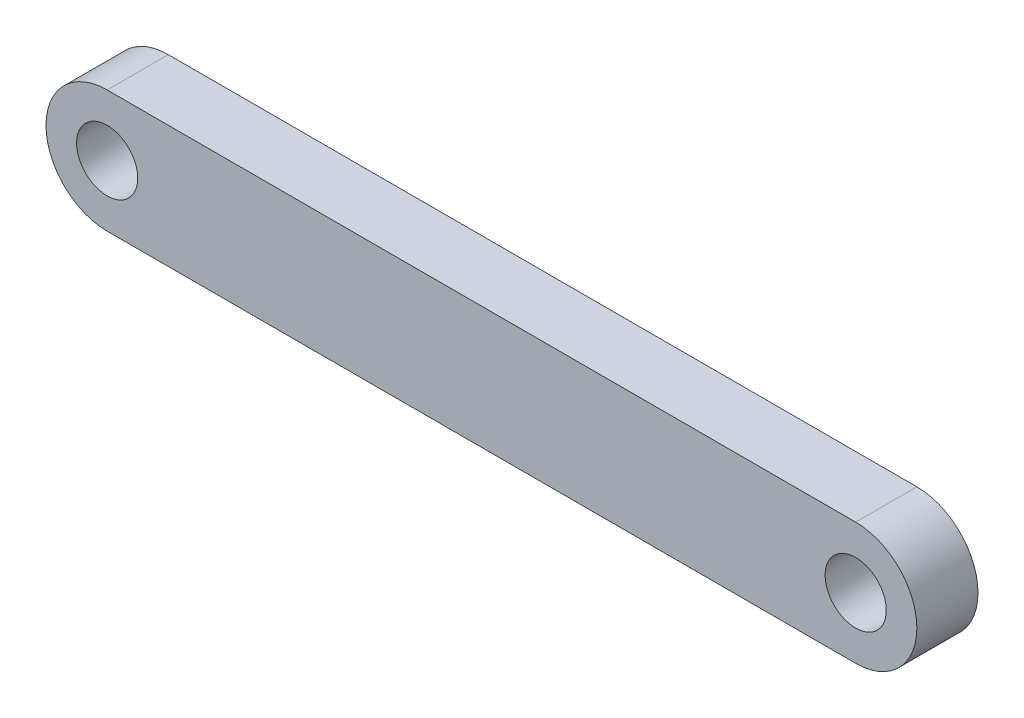
ISO-10303-21;
HEADER;
FILE_DESCRIPTION(('STEP AP214'),'2;1');
FILE_NAME('part.step','',(''),(''),'','','');
FILE_SCHEMA(('AUTOMOTIVE_DESIGN { 1 0 10303 214 1 1 1 1 }'));
ENDSEC;
DATA;
#1=APPLICATION_CONTEXT('core data for automotive mechanical design processes');
#2=APPLICATION_PROTOCOL_DEFINITION('international standard','automotive_design',2000,#1);
#3=PRODUCT_CONTEXT('',#1,'mechanical');
#4=PRODUCT('Part','Part','',(#3));
#5=PRODUCT_RELATED_PRODUCT_CATEGORY('part','',(#4));
#6=PRODUCT_DEFINITION_FORMATION('','',#4);
#7=PRODUCT_DEFINITION_CONTEXT('part definition',#1,'design');
#8=PRODUCT_DEFINITION('design','',#6,#7);
#9=PRODUCT_DEFINITION_SHAPE('','',#8);
#10=(LENGTH_UNIT() NAMED_UNIT(*) SI_UNIT(.MILLI.,.METRE.));
#11=(NAMED_UNIT(*) PLANE_ANGLE_UNIT() SI_UNIT($,.RADIAN.));
#12=(NAMED_UNIT(*) SI_UNIT($,.STERADIAN.) SOLID_ANGLE_UNIT());
#13=UNCERTAINTY_MEASURE_WITH_UNIT(LENGTH_MEASURE(1.E-05),#10,'distance_accuracy_value','');
#14=(GEOMETRIC_REPRESENTATION_CONTEXT(3) GLOBAL_UNCERTAINTY_ASSIGNED_CONTEXT((#13)) GLOBAL_UNIT_ASSIGNED_CONTEXT((#10,
#11,#12)) REPRESENTATION_CONTEXT('',''));
#15=CARTESIAN_POINT('',(0.,0.,0.));
#16=DIRECTION('',(0.,0.,1.));
#17=DIRECTION('',(1.,0.,0.));
#18=AXIS2_PLACEMENT_3D('',#15,#16,#17);
#19=CARTESIAN_POINT('',(-12.2399999837067,0.000631553616005661,2.));
#20=DIRECTION('',(0.,0.,1.));
#21=DIRECTION('',(1.,0.,0.));
#22=AXIS2_PLACEMENT_3D('',#19,#20,#21);
#23=PLANE('',#22);
#24=CARTESIAN_POINT('',(-12.2399999837067,0.000631553616005661,2.));
#25=DIRECTION('',(0.,0.,1.));
#26=DIRECTION('',(1.,0.,0.));
#27=AXIS2_PLACEMENT_3D('',#24,#25,#26);
#28=CIRCLE('',#27,1.);
#29=CARTESIAN_POINT('',(-11.2399999837067,0.000631553616005661,2.));
#30=VERTEX_POINT('',#29);
#31=EDGE_CURVE('E100',#30,#30,#28,.T.);
#32=ORIENTED_EDGE('',*,*,#31,.F.);
#33=EDGE_LOOP('',(#32));
#34=FACE_BOUND('',#33,.T.);
#35=CARTESIAN_POINT('',(-12.2399999837067,0.000631553616005661,2.));
#36=DIRECTION('',(0.,0.,1.));
#37=DIRECTION('',(1.,0.,0.));
#38=AXIS2_PLACEMENT_3D('',#35,#36,#37);
#39=CIRCLE('',#38,2.);
#40=CARTESIAN_POINT('',(-12.2399999837067,2.00063155361601,2.));
#41=VERTEX_POINT('',#40);
#42=CARTESIAN_POINT('',(-12.2399999837067,-1.99936844638399,2.));
#43=VERTEX_POINT('',#42);
#44=EDGE_CURVE('E85',#41,#43,#39,.T.);
#45=ORIENTED_EDGE('',*,*,#44,.T.);
#46=DIRECTION('',(1.,0.,0.));
#47=VECTOR('',#46,1.);
#48=CARTESIAN_POINT('',(-12.2399999837067,-1.99936844638399,2.));
#49=LINE('',#48,#47);
#50=CARTESIAN_POINT('',(12.2400000162933,-1.99936844638399,2.));
#51=VERTEX_POINT('',#50);
#52=EDGE_CURVE('E80',#43,#51,#49,.T.);
#53=ORIENTED_EDGE('',*,*,#52,.T.);
#54=CARTESIAN_POINT('',(12.2400000162933,0.000631553616005661,2.));
#55=DIRECTION('',(0.,0.,1.));
#56=DIRECTION('',(1.,0.,0.));
#57=AXIS2_PLACEMENT_3D('',#54,#55,#56);
#58=CIRCLE('',#57,2.);
#59=CARTESIAN_POINT('',(12.2400000162933,2.00063155361601,2.));
#60=VERTEX_POINT('',#59);
#61=EDGE_CURVE('E83',#51,#60,#58,.T.);
#62=ORIENTED_EDGE('',*,*,#61,.T.);
#63=DIRECTION('',(-1.,0.,0.));
#64=VECTOR('',#63,1.);
#65=CARTESIAN_POINT('',(-12.2399999837067,2.00063155361601,2.));
#66=LINE('',#65,#64);
#67=EDGE_CURVE('E50',#60,#41,#66,.T.);
#68=ORIENTED_EDGE('',*,*,#67,.T.);
#69=EDGE_LOOP('',(#45,#53,#62,#68));
#70=FACE_BOUND('',#69,.T.);
#71=CARTESIAN_POINT('',(12.2400000162933,0.000631553616005661,2.));
#72=DIRECTION('',(0.,0.,1.));
#73=DIRECTION('',(1.,0.,0.));
#74=AXIS2_PLACEMENT_3D('',#71,#72,#73);
#75=CIRCLE('',#74,1.);
#76=CARTESIAN_POINT('',(13.2400000162933,0.000631553616005661,2.));
#77=VERTEX_POINT('',#76);
#78=EDGE_CURVE('E115',#77,#77,#75,.T.);
#79=ORIENTED_EDGE('',*,*,#78,.F.);
#80=EDGE_LOOP('',(#79));
#81=FACE_BOUND('',#80,.T.);
#82=ADVANCED_FACE('F33',(#34,#70,#81),#23,.T.);
#83=CARTESIAN_POINT('',(-12.2399999837067,0.000631553616005661,0.));
#84=DIRECTION('',(0.,0.,1.));
#85=DIRECTION('',(1.,0.,0.));
#86=AXIS2_PLACEMENT_3D('',#83,#84,#85);
#87=PLANE('',#86);
#88=CARTESIAN_POINT('',(-12.2399999837067,0.000631553616005661,0.));
#89=DIRECTION('',(0.,0.,1.));
#90=DIRECTION('',(1.,0.,0.));
#91=AXIS2_PLACEMENT_3D('',#88,#89,#90);
#92=CIRCLE('',#91,2.);
#93=CARTESIAN_POINT('',(-12.2399999837067,2.00063155361601,0.));
#94=VERTEX_POINT('',#93);
#95=CARTESIAN_POINT('',(-12.2399999837067,-1.99936844638399,0.));
#96=VERTEX_POINT('',#95);
#97=EDGE_CURVE('E97',#94,#96,#92,.T.);
#98=ORIENTED_EDGE('',*,*,#97,.F.);
#99=DIRECTION('',(-1.,0.,0.));
#100=VECTOR('',#99,1.);
#101=CARTESIAN_POINT('',(-12.2399999837067,2.00063155361601,0.));
#102=LINE('',#101,#100);
#103=CARTESIAN_POINT('',(12.2400000162933,2.00063155361601,0.));
#104=VERTEX_POINT('',#103);
#105=EDGE_CURVE('E73',#104,#94,#102,.T.);
#106=ORIENTED_EDGE('',*,*,#105,.F.);
#107=CARTESIAN_POINT('',(12.2400000162933,0.000631553616005661,0.));
#108=DIRECTION('',(0.,0.,1.));
#109=DIRECTION('',(1.,0.,0.));
#110=AXIS2_PLACEMENT_3D('',#107,#108,#109);
#111=CIRCLE('',#110,2.);
#112=CARTESIAN_POINT('',(12.2400000162933,-1.99936844638399,0.));
#113=VERTEX_POINT('',#112);
#114=EDGE_CURVE('E67',#113,#104,#111,.T.);
#115=ORIENTED_EDGE('',*,*,#114,.F.);
#116=DIRECTION('',(1.,0.,0.));
#117=VECTOR('',#116,1.);
#118=CARTESIAN_POINT('',(-12.2399999837067,-1.99936844638399,0.));
#119=LINE('',#118,#117);
#120=EDGE_CURVE('E89',#96,#113,#119,.T.);
#121=ORIENTED_EDGE('',*,*,#120,.F.);
#122=EDGE_LOOP('',(#98,#106,#115,#121));
#123=FACE_BOUND('',#122,.T.);
#124=CARTESIAN_POINT('',(-12.2399999837067,0.000631553616005661,0.));
#125=DIRECTION('',(0.,0.,1.));
#126=DIRECTION('',(1.,0.,0.));
#127=AXIS2_PLACEMENT_3D('',#124,#125,#126);
#128=CIRCLE('',#127,1.);
#129=CARTESIAN_POINT('',(-11.2399999837067,0.000631553616005661,0.));
#130=VERTEX_POINT('',#129);
#131=EDGE_CURVE('E112',#130,#130,#128,.T.);
#132=ORIENTED_EDGE('',*,*,#131,.T.);
#133=EDGE_LOOP('',(#132));
#134=FACE_BOUND('',#133,.T.);
#135=CARTESIAN_POINT('',(12.2400000162933,0.000631553616005661,0.));
#136=DIRECTION('',(0.,0.,1.));
#137=DIRECTION('',(1.,0.,0.));
#138=AXIS2_PLACEMENT_3D('',#135,#136,#137);
#139=CIRCLE('',#138,1.);
#140=CARTESIAN_POINT('',(13.2400000162933,0.000631553616005661,0.));
#141=VERTEX_POINT('',#140);
#142=EDGE_CURVE('E118',#141,#141,#139,.T.);
#143=ORIENTED_EDGE('',*,*,#142,.T.);
#144=EDGE_LOOP('',(#143));
#145=FACE_BOUND('',#144,.T.);
#146=ADVANCED_FACE('F108',(#123,#134,#145),#87,.F.);
#147=CARTESIAN_POINT('',(-12.2399999837067,0.000631553616005661,2.));
#148=DIRECTION('',(0.,0.,-1.));
#149=DIRECTION('',(-1.,0.,0.));
#150=AXIS2_PLACEMENT_3D('',#147,#148,#149);
#151=CYLINDRICAL_SURFACE('',#150,2.);
#152=ORIENTED_EDGE('',*,*,#97,.T.);
#153=DIRECTION('',(0.,0.,-1.));
#154=VECTOR('',#153,1.);
#155=CARTESIAN_POINT('',(-12.2399999837067,-1.99936844638399,2.));
#156=LINE('',#155,#154);
#157=EDGE_CURVE('E11',#43,#96,#156,.T.);
#158=ORIENTED_EDGE('',*,*,#157,.F.);
#159=ORIENTED_EDGE('',*,*,#44,.F.);
#160=DIRECTION('',(0.,0.,-1.));
#161=VECTOR('',#160,1.);
#162=CARTESIAN_POINT('',(-12.2399999837067,2.00063155361601,2.));
#163=LINE('',#162,#161);
#164=EDGE_CURVE('E93',#41,#94,#163,.T.);
#165=ORIENTED_EDGE('',*,*,#164,.T.);
#166=EDGE_LOOP('',(#152,#158,#159,#165));
#167=FACE_BOUND('',#166,.T.);
#168=ADVANCED_FACE('F35',(#167),#151,.T.);
#169=CARTESIAN_POINT('',(-12.2399999837067,-1.99936844638399,2.));
#170=DIRECTION('',(0.,1.,0.));
#171=DIRECTION('',(0.,0.,1.));
#172=AXIS2_PLACEMENT_3D('',#169,#170,#171);
#173=PLANE('',#172);
#174=ORIENTED_EDGE('',*,*,#120,.T.);
#175=DIRECTION('',(0.,0.,-1.));
#176=VECTOR('',#175,1.);
#177=CARTESIAN_POINT('',(12.2400000162933,-1.99936844638399,2.));
#178=LINE('',#177,#176);
#179=EDGE_CURVE('E42',#51,#113,#178,.T.);
#180=ORIENTED_EDGE('',*,*,#179,.F.);
#181=ORIENTED_EDGE('',*,*,#52,.F.);
#182=ORIENTED_EDGE('',*,*,#157,.T.);
#183=EDGE_LOOP('',(#174,#180,#181,#182));
#184=FACE_BOUND('',#183,.T.);
#185=ADVANCED_FACE('F88',(#184),#173,.F.);
#186=CARTESIAN_POINT('',(12.2400000162933,0.000631553616005661,2.));
#187=DIRECTION('',(0.,0.,-1.));
#188=DIRECTION('',(-1.,0.,0.));
#189=AXIS2_PLACEMENT_3D('',#186,#187,#188);
#190=CYLINDRICAL_SURFACE('',#189,2.);
#191=ORIENTED_EDGE('',*,*,#114,.T.);
#192=DIRECTION('',(0.,0.,-1.));
#193=VECTOR('',#192,1.);
#194=CARTESIAN_POINT('',(12.2400000162933,2.00063155361601,2.));
#195=LINE('',#194,#193);
#196=EDGE_CURVE('E90',#60,#104,#195,.T.);
#197=ORIENTED_EDGE('',*,*,#196,.F.);
#198=ORIENTED_EDGE('',*,*,#61,.F.);
#199=ORIENTED_EDGE('',*,*,#179,.T.);
#200=EDGE_LOOP('',(#191,#197,#198,#199));
#201=FACE_BOUND('',#200,.T.);
#202=ADVANCED_FACE('F91',(#201),#190,.T.);
#203=CARTESIAN_POINT('',(-12.2399999837067,2.00063155361601,2.));
#204=DIRECTION('',(0.,-1.,0.));
#205=DIRECTION('',(0.,0.,-1.));
#206=AXIS2_PLACEMENT_3D('',#203,#204,#205);
#207=PLANE('',#206);
#208=ORIENTED_EDGE('',*,*,#105,.T.);
#209=ORIENTED_EDGE('',*,*,#164,.F.);
#210=ORIENTED_EDGE('',*,*,#67,.F.);
#211=ORIENTED_EDGE('',*,*,#196,.T.);
#212=EDGE_LOOP('',(#208,#209,#210,#211));
#213=FACE_BOUND('',#212,.T.);
#214=ADVANCED_FACE('F105',(#213),#207,.F.);
#215=CARTESIAN_POINT('',(-12.2399999837067,0.000631553616005661,2.));
#216=DIRECTION('',(0.,0.,-1.));
#217=DIRECTION('',(-1.,0.,0.));
#218=AXIS2_PLACEMENT_3D('',#215,#216,#217);
#219=CYLINDRICAL_SURFACE('',#218,1.);
#220=ORIENTED_EDGE('',*,*,#31,.T.);
#221=EDGE_LOOP('',(#220));
#222=FACE_BOUND('',#221,.T.);
#223=ORIENTED_EDGE('',*,*,#131,.F.);
#224=EDGE_LOOP('',(#223));
#225=FACE_BOUND('',#224,.T.);
#226=ADVANCED_FACE('F135',(#222,#225),#219,.F.);
#227=CARTESIAN_POINT('',(12.2400000162933,0.000631553616005661,2.));
#228=DIRECTION('',(0.,0.,-1.));
#229=DIRECTION('',(-1.,0.,0.));
#230=AXIS2_PLACEMENT_3D('',#227,#228,#229);
#231=CYLINDRICAL_SURFACE('',#230,1.);
#232=ORIENTED_EDGE('',*,*,#78,.T.);
#233=EDGE_LOOP('',(#232));
#234=FACE_BOUND('',#233,.T.);
#235=ORIENTED_EDGE('',*,*,#142,.F.);
#236=EDGE_LOOP('',(#235));
#237=FACE_BOUND('',#236,.T.);
#238=ADVANCED_FACE('F124',(#234,#237),#231,.F.);
#239=CLOSED_SHELL('',(#82,#146,#168,#185,#202,#214,#226,#238));
#240=MANIFOLD_SOLID_BREP('B2',#239);
#241=ADVANCED_BREP_SHAPE_REPRESENTATION('',(#18,#240),#14);
#242=SHAPE_DEFINITION_REPRESENTATION(#9,#241);
ENDSEC;
END-ISO-10303-21;
